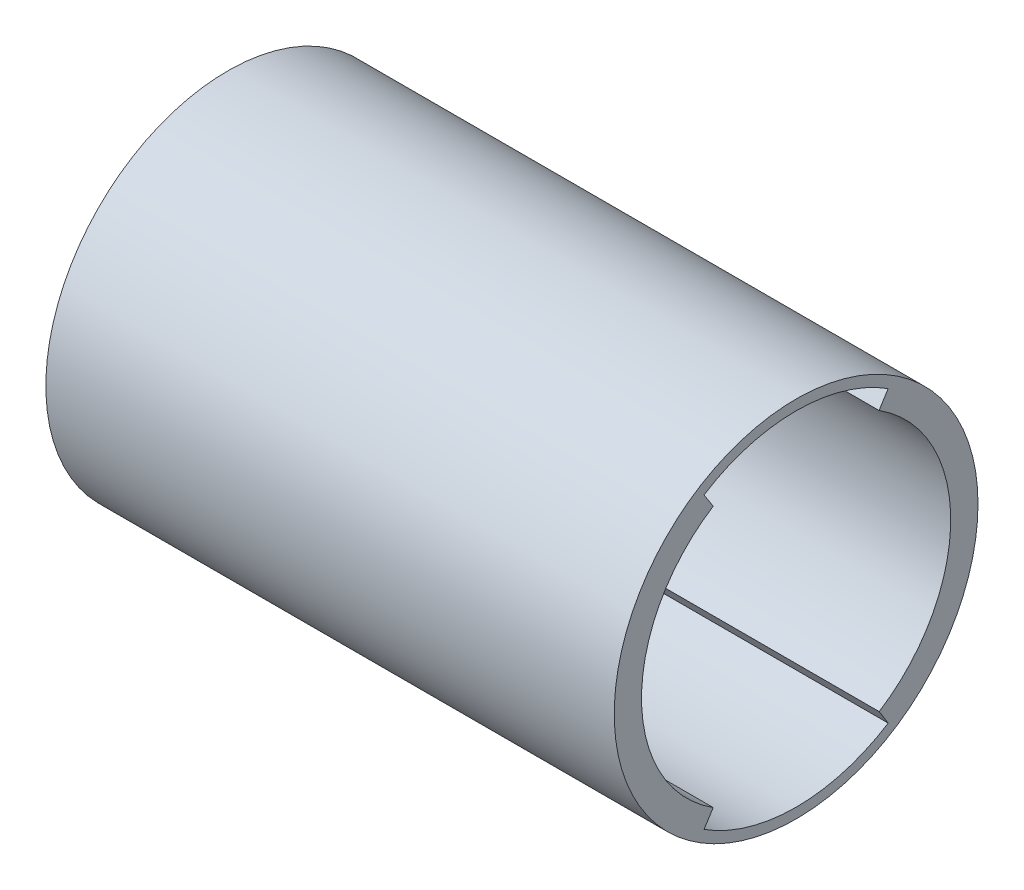
ISO-10303-21;
HEADER;
FILE_DESCRIPTION(('STEP AP214'),'2;1');
FILE_NAME('part.step','',(''),(''),'','','');
FILE_SCHEMA(('AUTOMOTIVE_DESIGN { 1 0 10303 214 1 1 1 1 }'));
ENDSEC;
DATA;
#1=APPLICATION_CONTEXT('core data for automotive mechanical design processes');
#2=APPLICATION_PROTOCOL_DEFINITION('international standard','automotive_design',2000,#1);
#3=PRODUCT_CONTEXT('',#1,'mechanical');
#4=PRODUCT('Part','Part','',(#3));
#5=PRODUCT_RELATED_PRODUCT_CATEGORY('part','',(#4));
#6=PRODUCT_DEFINITION_FORMATION('','',#4);
#7=PRODUCT_DEFINITION_CONTEXT('part definition',#1,'design');
#8=PRODUCT_DEFINITION('design','',#6,#7);
#9=PRODUCT_DEFINITION_SHAPE('','',#8);
#10=(LENGTH_UNIT() NAMED_UNIT(*) SI_UNIT(.MILLI.,.METRE.));
#11=(NAMED_UNIT(*) PLANE_ANGLE_UNIT() SI_UNIT($,.RADIAN.));
#12=(NAMED_UNIT(*) SI_UNIT($,.STERADIAN.) SOLID_ANGLE_UNIT());
#13=UNCERTAINTY_MEASURE_WITH_UNIT(LENGTH_MEASURE(1.E-05),#10,'distance_accuracy_value','');
#14=(GEOMETRIC_REPRESENTATION_CONTEXT(3) GLOBAL_UNCERTAINTY_ASSIGNED_CONTEXT((#13)) GLOBAL_UNIT_ASSIGNED_CONTEXT((#10,
#11,#12)) REPRESENTATION_CONTEXT('',''));
#15=CARTESIAN_POINT('',(0.,0.,0.));
#16=DIRECTION('',(0.,0.,1.));
#17=DIRECTION('',(1.,0.,0.));
#18=AXIS2_PLACEMENT_3D('',#15,#16,#17);
#19=CARTESIAN_POINT('',(50.,0.,0.));
#20=DIRECTION('',(-1.,0.,0.));
#21=DIRECTION('',(0.,0.,1.));
#22=AXIS2_PLACEMENT_3D('',#19,#20,#21);
#23=CYLINDRICAL_SURFACE('',#22,13.6);
#24=DIRECTION('',(1.,0.,0.));
#25=VECTOR('',#24,1.);
#26=CARTESIAN_POINT('',(0.,11.4777027592162,-7.29536423841059));
#27=LINE('',#26,#25);
#28=CARTESIAN_POINT('',(0.,11.4777027592162,-7.29536423841059));
#29=VERTEX_POINT('',#28);
#30=CARTESIAN_POINT('',(50.,11.4777027592162,-7.29536423841059));
#31=VERTEX_POINT('',#30);
#32=EDGE_CURVE('E198',#29,#31,#27,.T.);
#33=ORIENTED_EDGE('',*,*,#32,.F.);
#34=CARTESIAN_POINT('',(0.,0.,0.));
#35=DIRECTION('',(1.,0.,0.));
#36=DIRECTION('',(0.,0.,-1.));
#37=AXIS2_PLACEMENT_3D('',#34,#35,#36);
#38=CIRCLE('',#37,13.6);
#39=CARTESIAN_POINT('',(0.,-11.4690515207206,-7.30895732748911));
#40=VERTEX_POINT('',#39);
#41=EDGE_CURVE('E200',#40,#29,#38,.T.);
#42=ORIENTED_EDGE('',*,*,#41,.F.);
#43=DIRECTION('',(1.,0.,0.));
#44=VECTOR('',#43,1.);
#45=CARTESIAN_POINT('',(0.,-11.4690515207206,-7.30895732748911));
#46=LINE('',#45,#44);
#47=CARTESIAN_POINT('',(50.,-11.4690515207206,-7.30895732748912));
#48=VERTEX_POINT('',#47);
#49=EDGE_CURVE('E240',#40,#48,#46,.T.);
#50=ORIENTED_EDGE('',*,*,#49,.T.);
#51=CARTESIAN_POINT('',(50.,0.,0.));
#52=DIRECTION('',(1.,0.,0.));
#53=DIRECTION('',(0.,0.,-1.));
#54=AXIS2_PLACEMENT_3D('',#51,#52,#53);
#55=CIRCLE('',#54,13.6);
#56=EDGE_CURVE('E202',#48,#31,#55,.T.);
#57=ORIENTED_EDGE('',*,*,#56,.T.);
#58=EDGE_LOOP('',(#33,#42,#50,#57));
#59=FACE_BOUND('',#58,.T.);
#60=ADVANCED_FACE('F37',(#59),#23,.F.);
#61=CARTESIAN_POINT('',(50.,0.,0.));
#62=DIRECTION('',(1.,0.,0.));
#63=DIRECTION('',(0.,0.,-1.));
#64=AXIS2_PLACEMENT_3D('',#61,#62,#63);
#65=PLANE('',#64);
#66=DIRECTION('',(0.,0.84394873229531,-0.536423841059603));
#67=VECTOR('',#66,1.);
#68=CARTESIAN_POINT('',(50.,12.7436258576592,-8.1));
#69=LINE('',#68,#67);
#70=CARTESIAN_POINT('',(50.,12.7436258576592,-8.1));
#71=VERTEX_POINT('',#70);
#72=EDGE_CURVE('E265',#31,#71,#69,.T.);
#73=ORIENTED_EDGE('',*,*,#72,.F.);
#74=ORIENTED_EDGE('',*,*,#56,.F.);
#75=DIRECTION('',(0.,0.849661800788239,0.527328004453857));
#76=VECTOR('',#75,1.);
#77=CARTESIAN_POINT('',(50.,-12.7436258576592,-8.1));
#78=LINE('',#77,#76);
#79=CARTESIAN_POINT('',(50.,-12.7436258576592,-8.1));
#80=VERTEX_POINT('',#79);
#81=EDGE_CURVE('E59',#80,#48,#78,.T.);
#82=ORIENTED_EDGE('',*,*,#81,.F.);
#83=CARTESIAN_POINT('',(50.,0.,0.));
#84=DIRECTION('',(1.,0.,0.));
#85=DIRECTION('',(0.,0.,-1.));
#86=AXIS2_PLACEMENT_3D('',#83,#84,#85);
#87=CIRCLE('',#86,15.1);
#88=CARTESIAN_POINT('',(50.,-12.7436258576592,8.1));
#89=VERTEX_POINT('',#88);
#90=EDGE_CURVE('E256',#89,#80,#87,.T.);
#91=ORIENTED_EDGE('',*,*,#90,.F.);
#92=DIRECTION('',(0.,-0.843948732295311,0.536423841059602));
#93=VECTOR('',#92,1.);
#94=CARTESIAN_POINT('',(50.,-12.7436258576592,8.1));
#95=LINE('',#94,#93);
#96=CARTESIAN_POINT('',(50.,-11.4777027592162,7.29536423841059));
#97=VERTEX_POINT('',#96);
#98=EDGE_CURVE('E258',#97,#89,#95,.T.);
#99=ORIENTED_EDGE('',*,*,#98,.F.);
#100=CARTESIAN_POINT('',(50.,11.4777027592162,7.2953642384106));
#101=VERTEX_POINT('',#100);
#102=EDGE_CURVE('E229',#101,#97,#55,.T.);
#103=ORIENTED_EDGE('',*,*,#102,.F.);
#104=DIRECTION('',(0.,-0.843948732295311,-0.536423841059602));
#105=VECTOR('',#104,1.);
#106=CARTESIAN_POINT('',(50.,12.7436258576592,8.1));
#107=LINE('',#106,#105);
#108=CARTESIAN_POINT('',(50.,12.7436258576592,8.1));
#109=VERTEX_POINT('',#108);
#110=EDGE_CURVE('E268',#109,#101,#107,.T.);
#111=ORIENTED_EDGE('',*,*,#110,.F.);
#112=CARTESIAN_POINT('',(50.,0.,0.));
#113=DIRECTION('',(1.,0.,0.));
#114=DIRECTION('',(0.,0.,1.));
#115=AXIS2_PLACEMENT_3D('',#112,#113,#114);
#116=CIRCLE('',#115,15.1);
#117=EDGE_CURVE('E270',#71,#109,#116,.T.);
#118=ORIENTED_EDGE('',*,*,#117,.F.);
#119=EDGE_LOOP('',(#73,#74,#82,#91,#99,#103,#111,#118));
#120=FACE_BOUND('',#119,.T.);
#121=CARTESIAN_POINT('',(50.,0.,0.));
#122=DIRECTION('',(1.,0.,0.));
#123=DIRECTION('',(0.,0.,-1.));
#124=AXIS2_PLACEMENT_3D('',#121,#122,#123);
#125=CIRCLE('',#124,16.);
#126=CARTESIAN_POINT('',(50.,0.,-16.));
#127=VERTEX_POINT('',#126);
#128=EDGE_CURVE('E222',#127,#127,#125,.T.);
#129=ORIENTED_EDGE('',*,*,#128,.T.);
#130=EDGE_LOOP('',(#129));
#131=FACE_BOUND('',#130,.T.);
#132=ADVANCED_FACE('F179',(#120,#131),#65,.T.);
#133=CARTESIAN_POINT('',(0.,0.,0.));
#134=DIRECTION('',(1.,0.,0.));
#135=DIRECTION('',(0.,0.,-1.));
#136=AXIS2_PLACEMENT_3D('',#133,#134,#135);
#137=PLANE('',#136);
#138=CARTESIAN_POINT('',(0.,0.,0.));
#139=DIRECTION('',(1.,0.,0.));
#140=DIRECTION('',(0.,0.,-1.));
#141=AXIS2_PLACEMENT_3D('',#138,#139,#140);
#142=CIRCLE('',#141,16.);
#143=CARTESIAN_POINT('',(0.,0.,-16.));
#144=VERTEX_POINT('',#143);
#145=EDGE_CURVE('E226',#144,#144,#142,.T.);
#146=ORIENTED_EDGE('',*,*,#145,.F.);
#147=EDGE_LOOP('',(#146));
#148=FACE_BOUND('',#147,.T.);
#149=ORIENTED_EDGE('',*,*,#41,.T.);
#150=DIRECTION('',(0.,0.84394873229531,-0.536423841059603));
#151=VECTOR('',#150,1.);
#152=CARTESIAN_POINT('',(0.,12.7436258576592,-8.1));
#153=LINE('',#152,#151);
#154=CARTESIAN_POINT('',(0.,12.7436258576592,-8.1));
#155=VERTEX_POINT('',#154);
#156=EDGE_CURVE('E211',#29,#155,#153,.T.);
#157=ORIENTED_EDGE('',*,*,#156,.T.);
#158=CARTESIAN_POINT('',(0.,0.,0.));
#159=DIRECTION('',(1.,0.,0.));
#160=DIRECTION('',(0.,0.,1.));
#161=AXIS2_PLACEMENT_3D('',#158,#159,#160);
#162=CIRCLE('',#161,15.1);
#163=CARTESIAN_POINT('',(0.,12.7436258576592,8.1));
#164=VERTEX_POINT('',#163);
#165=EDGE_CURVE('E267',#155,#164,#162,.T.);
#166=ORIENTED_EDGE('',*,*,#165,.T.);
#167=DIRECTION('',(0.,-0.843948732295311,-0.536423841059602));
#168=VECTOR('',#167,1.);
#169=CARTESIAN_POINT('',(0.,12.7436258576592,8.1));
#170=LINE('',#169,#168);
#171=CARTESIAN_POINT('',(0.,11.4777027592162,7.2953642384106));
#172=VERTEX_POINT('',#171);
#173=EDGE_CURVE('E274',#164,#172,#170,.T.);
#174=ORIENTED_EDGE('',*,*,#173,.T.);
#175=CARTESIAN_POINT('',(0.,-11.4777027592162,7.29536423841059));
#176=VERTEX_POINT('',#175);
#177=EDGE_CURVE('E215',#172,#176,#38,.T.);
#178=ORIENTED_EDGE('',*,*,#177,.T.);
#179=DIRECTION('',(0.,-0.843948732295311,0.536423841059602));
#180=VECTOR('',#179,1.);
#181=CARTESIAN_POINT('',(0.,-12.7436258576592,8.1));
#182=LINE('',#181,#180);
#183=CARTESIAN_POINT('',(0.,-12.7436258576592,8.1));
#184=VERTEX_POINT('',#183);
#185=EDGE_CURVE('E248',#176,#184,#182,.T.);
#186=ORIENTED_EDGE('',*,*,#185,.T.);
#187=CARTESIAN_POINT('',(0.,0.,0.));
#188=DIRECTION('',(1.,0.,0.));
#189=DIRECTION('',(0.,0.,-1.));
#190=AXIS2_PLACEMENT_3D('',#187,#188,#189);
#191=CIRCLE('',#190,15.1);
#192=CARTESIAN_POINT('',(0.,-12.7436258576592,-8.1));
#193=VERTEX_POINT('',#192);
#194=EDGE_CURVE('E252',#184,#193,#191,.T.);
#195=ORIENTED_EDGE('',*,*,#194,.T.);
#196=DIRECTION('',(0.,0.849661800788239,0.527328004453857));
#197=VECTOR('',#196,1.);
#198=CARTESIAN_POINT('',(0.,-12.7436258576592,-8.1));
#199=LINE('',#198,#197);
#200=EDGE_CURVE('E214',#193,#40,#199,.T.);
#201=ORIENTED_EDGE('',*,*,#200,.T.);
#202=EDGE_LOOP('',(#149,#157,#166,#174,#178,#186,#195,#201));
#203=FACE_BOUND('',#202,.T.);
#204=ADVANCED_FACE('F181',(#148,#203),#137,.F.);
#205=CARTESIAN_POINT('',(50.,0.,0.));
#206=DIRECTION('',(-1.,0.,0.));
#207=DIRECTION('',(0.,0.,1.));
#208=AXIS2_PLACEMENT_3D('',#205,#206,#207);
#209=CYLINDRICAL_SURFACE('',#208,16.);
#210=ORIENTED_EDGE('',*,*,#128,.F.);
#211=EDGE_LOOP('',(#210));
#212=FACE_BOUND('',#211,.T.);
#213=ORIENTED_EDGE('',*,*,#145,.T.);
#214=EDGE_LOOP('',(#213));
#215=FACE_BOUND('',#214,.T.);
#216=ADVANCED_FACE('F39',(#212,#215),#209,.T.);
#217=CARTESIAN_POINT('',(25.,0.,0.));
#218=DIRECTION('',(1.,0.,0.));
#219=DIRECTION('',(0.,0.,-1.));
#220=AXIS2_PLACEMENT_3D('',#217,#218,#219);
#221=CIRCLE('',#220,13.6);
#222=CARTESIAN_POINT('',(25.,-9.21362131237046,10.0034585175445));
#223=VERTEX_POINT('',#222);
#224=CARTESIAN_POINT('',(25.,-11.4777027592162,7.29536423841059));
#225=VERTEX_POINT('',#224);
#226=EDGE_CURVE('E11',#223,#225,#221,.T.);
#227=ORIENTED_EDGE('',*,*,#226,.F.);
#228=DIRECTION('',(-1.,0.,0.));
#229=VECTOR('',#228,1.);
#230=CARTESIAN_POINT('',(50.,-9.21362131237047,10.0034585175445));
#231=LINE('',#230,#229);
#232=CARTESIAN_POINT('',(7.,-9.21362131237046,10.0034585175445));
#233=VERTEX_POINT('',#232);
#234=EDGE_CURVE('E225',#233,#223,#231,.F.);
#235=ORIENTED_EDGE('',*,*,#234,.F.);
#236=CARTESIAN_POINT('',(7.,0.,0.));
#237=DIRECTION('',(-1.,0.,0.));
#238=DIRECTION('',(0.,0.,1.));
#239=AXIS2_PLACEMENT_3D('',#236,#237,#238);
#240=CIRCLE('',#239,13.6);
#241=CARTESIAN_POINT('',(7.,-11.4777027592162,7.29536423841059));
#242=VERTEX_POINT('',#241);
#243=EDGE_CURVE('E45',#242,#233,#240,.T.);
#244=ORIENTED_EDGE('',*,*,#243,.F.);
#245=DIRECTION('',(1.,0.,0.));
#246=VECTOR('',#245,1.);
#247=CARTESIAN_POINT('',(0.,-11.4777027592162,7.29536423841059));
#248=LINE('',#247,#246);
#249=EDGE_CURVE('E239',#176,#242,#248,.T.);
#250=ORIENTED_EDGE('',*,*,#249,.F.);
#251=ORIENTED_EDGE('',*,*,#177,.F.);
#252=DIRECTION('',(1.,0.,0.));
#253=VECTOR('',#252,1.);
#254=CARTESIAN_POINT('',(0.,11.4777027592162,7.2953642384106));
#255=LINE('',#254,#253);
#256=EDGE_CURVE('E206',#172,#101,#255,.T.);
#257=ORIENTED_EDGE('',*,*,#256,.T.);
#258=ORIENTED_EDGE('',*,*,#102,.T.);
#259=EDGE_CURVE('E234',#225,#97,#248,.T.);
#260=ORIENTED_EDGE('',*,*,#259,.F.);
#261=EDGE_LOOP('',(#227,#235,#244,#250,#251,#257,#258,#260));
#262=FACE_BOUND('',#261,.T.);
#263=ADVANCED_FACE('F174',(#262),#23,.F.);
#264=CARTESIAN_POINT('',(0.,0.,0.));
#265=DIRECTION('',(1.,0.,0.));
#266=DIRECTION('',(0.,0.,-1.));
#267=AXIS2_PLACEMENT_3D('',#264,#265,#266);
#268=CYLINDRICAL_SURFACE('',#267,15.1);
#269=ORIENTED_EDGE('',*,*,#90,.T.);
#270=DIRECTION('',(1.,0.,0.));
#271=VECTOR('',#270,1.);
#272=CARTESIAN_POINT('',(0.,-12.7436258576592,-8.1));
#273=LINE('',#272,#271);
#274=EDGE_CURVE('E244',#193,#80,#273,.T.);
#275=ORIENTED_EDGE('',*,*,#274,.F.);
#276=ORIENTED_EDGE('',*,*,#194,.F.);
#277=DIRECTION('',(1.,0.,0.));
#278=VECTOR('',#277,1.);
#279=CARTESIAN_POINT('',(0.,-12.7436258576592,8.1));
#280=LINE('',#279,#278);
#281=EDGE_CURVE('E243',#184,#89,#280,.T.);
#282=ORIENTED_EDGE('',*,*,#281,.T.);
#283=EDGE_LOOP('',(#269,#275,#276,#282));
#284=FACE_BOUND('',#283,.T.);
#285=ADVANCED_FACE('F168',(#284),#268,.F.);
#286=CARTESIAN_POINT('',(0.,-12.7436258576592,8.1));
#287=DIRECTION('',(0.,0.536423841059602,0.843948732295311));
#288=DIRECTION('',(0.,-0.843948732295311,0.536423841059602));
#289=AXIS2_PLACEMENT_3D('',#286,#287,#288);
#290=PLANE('',#289);
#291=ORIENTED_EDGE('',*,*,#249,.T.);
#292=CARTESIAN_POINT('',(25.,-11.4777027592162,7.29536423841059));
#293=CARTESIAN_POINT('',(25.4196481330282,-12.2653037100379,7.79597276010705));
#294=CARTESIAN_POINT('',(22.2153032367959,-12.0680146181913,7.67057346937087));
#295=CARTESIAN_POINT('',(19.1828891814806,-12.1514158885266,7.72358430767246));
#296=CARTESIAN_POINT('',(18.4286290047042,-12.1652412788108,7.7323718899942));
#297=CARTESIAN_POINT('',(16.2839312274656,-12.1501772047085,7.72279698552109));
#298=CARTESIAN_POINT('',(13.1862280612341,-12.3797251276439,7.86870037255903));
#299=CARTESIAN_POINT('',(11.0280889367316,-11.0781039548783,7.04137449080735));
#300=CARTESIAN_POINT('',(8.81915060891149,-12.6393712738354,8.03373454789043));
#301=CARTESIAN_POINT('',(6.99999999999994,-11.4777027592162,7.29536423841057));
#302=B_SPLINE_CURVE_WITH_KNOTS('',3,(#292,#293,#294,#295,#296,#297,#298,#299,#300,#301),
.UNSPECIFIED.,.F.,.F.,(4,1,1,1,1,1,1,4),(0.,0.204097014274196,0.238608821099265,
0.396578618916554,0.439763334076145,0.627271257535585,0.685638773171213,1.),.UNSPECIFIED.);
#303=EDGE_CURVE('E124',#225,#242,#302,.T.);
#304=ORIENTED_EDGE('',*,*,#303,.F.);
#305=ORIENTED_EDGE('',*,*,#259,.T.);
#306=ORIENTED_EDGE('',*,*,#98,.T.);
#307=ORIENTED_EDGE('',*,*,#281,.F.);
#308=ORIENTED_EDGE('',*,*,#185,.F.);
#309=EDGE_LOOP('',(#291,#304,#305,#306,#307,#308));
#310=FACE_BOUND('',#309,.T.);
#311=ADVANCED_FACE('F165',(#310),#290,.F.);
#312=CARTESIAN_POINT('',(0.,-12.7436258576592,-8.1));
#313=DIRECTION('',(0.,0.527328004453857,-0.849661800788239));
#314=DIRECTION('',(0.,0.849661800788239,0.527328004453857));
#315=AXIS2_PLACEMENT_3D('',#312,#313,#314);
#316=PLANE('',#315);
#317=ORIENTED_EDGE('',*,*,#81,.T.);
#318=ORIENTED_EDGE('',*,*,#49,.F.);
#319=ORIENTED_EDGE('',*,*,#200,.F.);
#320=ORIENTED_EDGE('',*,*,#274,.T.);
#321=EDGE_LOOP('',(#317,#318,#319,#320));
#322=FACE_BOUND('',#321,.T.);
#323=ADVANCED_FACE('F163',(#322),#316,.F.);
#324=CARTESIAN_POINT('',(0.,0.,0.));
#325=DIRECTION('',(1.,0.,0.));
#326=DIRECTION('',(0.,0.,-1.));
#327=AXIS2_PLACEMENT_3D('',#324,#325,#326);
#328=CYLINDRICAL_SURFACE('',#327,15.1);
#329=ORIENTED_EDGE('',*,*,#117,.T.);
#330=DIRECTION('',(1.,0.,0.));
#331=VECTOR('',#330,1.);
#332=CARTESIAN_POINT('',(0.,12.7436258576592,8.1));
#333=LINE('',#332,#331);
#334=EDGE_CURVE('E262',#164,#109,#333,.T.);
#335=ORIENTED_EDGE('',*,*,#334,.F.);
#336=ORIENTED_EDGE('',*,*,#165,.F.);
#337=DIRECTION('',(1.,0.,0.));
#338=VECTOR('',#337,1.);
#339=CARTESIAN_POINT('',(0.,12.7436258576592,-8.1));
#340=LINE('',#339,#338);
#341=EDGE_CURVE('E205',#155,#71,#340,.T.);
#342=ORIENTED_EDGE('',*,*,#341,.T.);
#343=EDGE_LOOP('',(#329,#335,#336,#342));
#344=FACE_BOUND('',#343,.T.);
#345=ADVANCED_FACE('F156',(#344),#328,.F.);
#346=CARTESIAN_POINT('',(0.,12.7436258576592,-8.1));
#347=DIRECTION('',(0.,-0.536423841059603,-0.84394873229531));
#348=DIRECTION('',(0.,0.843948732295311,-0.536423841059603));
#349=AXIS2_PLACEMENT_3D('',#346,#347,#348);
#350=PLANE('',#349);
#351=ORIENTED_EDGE('',*,*,#72,.T.);
#352=ORIENTED_EDGE('',*,*,#341,.F.);
#353=ORIENTED_EDGE('',*,*,#156,.F.);
#354=ORIENTED_EDGE('',*,*,#32,.T.);
#355=EDGE_LOOP('',(#351,#352,#353,#354));
#356=FACE_BOUND('',#355,.T.);
#357=ADVANCED_FACE('F153',(#356),#350,.F.);
#358=CARTESIAN_POINT('',(0.,12.7436258576592,8.1));
#359=DIRECTION('',(0.,-0.536423841059602,0.843948732295311));
#360=DIRECTION('',(0.,-0.843948732295311,-0.536423841059602));
#361=AXIS2_PLACEMENT_3D('',#358,#359,#360);
#362=PLANE('',#361);
#363=ORIENTED_EDGE('',*,*,#110,.T.);
#364=ORIENTED_EDGE('',*,*,#256,.F.);
#365=ORIENTED_EDGE('',*,*,#173,.F.);
#366=ORIENTED_EDGE('',*,*,#334,.T.);
#367=EDGE_LOOP('',(#363,#364,#365,#366));
#368=FACE_BOUND('',#367,.T.);
#369=ADVANCED_FACE('F151',(#368),#362,.F.);
#370=CARTESIAN_POINT('',(25.,-9.60021931550762,10.2491848014442));
#371=CARTESIAN_POINT('',(25.4196481330282,-10.3878202663293,10.7497933231406));
#372=CARTESIAN_POINT('',(22.2153032367959,-10.1905311744827,10.6243940324045));
#373=CARTESIAN_POINT('',(19.1828891814806,-10.273932444818,10.6774048707061));
#374=CARTESIAN_POINT('',(18.4286290047042,-10.2877578351022,10.6861924530278));
#375=CARTESIAN_POINT('',(16.2839312274656,-10.2726937609999,10.6766175485547));
#376=CARTESIAN_POINT('',(13.1862280612341,-10.5022416839353,10.8225209355926));
#377=CARTESIAN_POINT('',(11.0280889367316,-9.20062051116972,9.99519505384094));
#378=CARTESIAN_POINT('',(8.81915060891149,-10.7618878301268,10.987555110924));
#379=CARTESIAN_POINT('',(6.99999999999994,-9.60021931550759,10.2491848014442));
#380=B_SPLINE_CURVE_WITH_KNOTS('',3,(#370,#371,#372,#373,#374,#375,#376,#377,#378,#379),
.UNSPECIFIED.,.F.,.F.,(4,1,1,1,1,1,1,4),(0.,0.204097014274196,0.238608821099265,
0.396578618916554,0.439763334076145,0.627271257535585,0.685638773171213,1.),.UNSPECIFIED.);
#381=DIRECTION('',(0.,-0.536423841059602,-0.843948732295311));
#382=VECTOR('',#381,1.);
#383=SURFACE_OF_LINEAR_EXTRUSION('',#380,#382);
#384=ORIENTED_EDGE('',*,*,#303,.T.);
#385=DIRECTION('',(0.,-0.536423841059602,-0.843948732295311));
#386=VECTOR('',#385,1.);
#387=CARTESIAN_POINT('',(7.,-9.60021931550762,10.2491848014442));
#388=LINE('',#387,#386);
#389=CARTESIAN_POINT('',(7.,-9.60021931550762,10.2491848014442));
#390=VERTEX_POINT('',#389);
#391=EDGE_CURVE('E118',#390,#242,#388,.T.);
#392=ORIENTED_EDGE('',*,*,#391,.F.);
#393=CARTESIAN_POINT('',(25.,-9.60021931550762,10.2491848014442));
#394=VERTEX_POINT('',#393);
#395=EDGE_CURVE('E122',#394,#390,#380,.T.);
#396=ORIENTED_EDGE('',*,*,#395,.F.);
#397=DIRECTION('',(0.,-0.536423841059602,-0.843948732295311));
#398=VECTOR('',#397,1.);
#399=CARTESIAN_POINT('',(25.,-9.60021931550762,10.2491848014442));
#400=LINE('',#399,#398);
#401=EDGE_CURVE('E52',#394,#225,#400,.T.);
#402=ORIENTED_EDGE('',*,*,#401,.T.);
#403=EDGE_LOOP('',(#384,#392,#396,#402));
#404=FACE_BOUND('',#403,.T.);
#405=ADVANCED_FACE('F120',(#404),#383,.F.);
#406=CARTESIAN_POINT('',(25.,-8.62621431021526,9.63009564809098));
#407=DIRECTION('',(1.,0.,0.));
#408=DIRECTION('',(0.,0.,-1.));
#409=AXIS2_PLACEMENT_3D('',#406,#407,#408);
#410=PLANE('',#409);
#411=ORIENTED_EDGE('',*,*,#226,.T.);
#412=ORIENTED_EDGE('',*,*,#401,.F.);
#413=DIRECTION('',(0.,-0.843948732295311,0.536423841059602));
#414=VECTOR('',#413,1.);
#415=CARTESIAN_POINT('',(25.,-8.62621431021526,9.63009564809098));
#416=LINE('',#415,#414);
#417=EDGE_CURVE('E127',#223,#394,#416,.T.);
#418=ORIENTED_EDGE('',*,*,#417,.F.);
#419=EDGE_LOOP('',(#411,#412,#418));
#420=FACE_BOUND('',#419,.T.);
#421=ADVANCED_FACE('F150',(#420),#410,.F.);
#422=CARTESIAN_POINT('',(7.,-9.60021931550762,10.2491848014442));
#423=DIRECTION('',(-1.,0.,0.));
#424=DIRECTION('',(0.,0.,1.));
#425=AXIS2_PLACEMENT_3D('',#422,#423,#424);
#426=PLANE('',#425);
#427=ORIENTED_EDGE('',*,*,#243,.T.);
#428=DIRECTION('',(0.,0.843948732295311,-0.536423841059602));
#429=VECTOR('',#428,1.);
#430=CARTESIAN_POINT('',(7.,-9.60021931550762,10.2491848014442));
#431=LINE('',#430,#429);
#432=EDGE_CURVE('E130',#390,#233,#431,.T.);
#433=ORIENTED_EDGE('',*,*,#432,.F.);
#434=ORIENTED_EDGE('',*,*,#391,.T.);
#435=EDGE_LOOP('',(#427,#433,#434));
#436=FACE_BOUND('',#435,.T.);
#437=ADVANCED_FACE('F131',(#436),#426,.F.);
#438=CARTESIAN_POINT('',(15.6787929846861,-10.326503458521,10.710819631603));
#439=DIRECTION('',(0.,0.536423841059602,0.843948732295311));
#440=DIRECTION('',(0.,-0.843948732295311,0.536423841059602));
#441=AXIS2_PLACEMENT_3D('',#438,#439,#440);
#442=PLANE('',#441);
#443=ORIENTED_EDGE('',*,*,#234,.T.);
#444=ORIENTED_EDGE('',*,*,#417,.T.);
#445=ORIENTED_EDGE('',*,*,#395,.T.);
#446=ORIENTED_EDGE('',*,*,#432,.T.);
#447=EDGE_LOOP('',(#443,#444,#445,#446));
#448=FACE_BOUND('',#447,.T.);
#449=ADVANCED_FACE('F135',(#448),#442,.F.);
#450=CLOSED_SHELL('',(#60,#132,#204,#216,#263,#285,#311,#323,#345,#357,#369,#405,#421,#437,#449));
#451=MANIFOLD_SOLID_BREP('B2',#450);
#452=ADVANCED_BREP_SHAPE_REPRESENTATION('',(#18,#451),#14);
#453=SHAPE_DEFINITION_REPRESENTATION(#9,#452);
ENDSEC;
END-ISO-10303-21;
